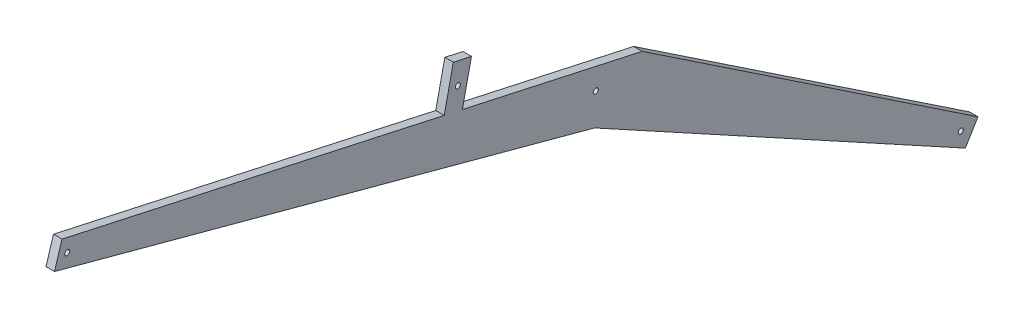
ISO-10303-21;
HEADER;
FILE_DESCRIPTION(('STEP AP214'),'2;1');
FILE_NAME('part.step','',(''),(''),'','','');
FILE_SCHEMA(('AUTOMOTIVE_DESIGN { 1 0 10303 214 1 1 1 1 }'));
ENDSEC;
DATA;
#1=APPLICATION_CONTEXT('core data for automotive mechanical design processes');
#2=APPLICATION_PROTOCOL_DEFINITION('international standard','automotive_design',2000,#1);
#3=PRODUCT_CONTEXT('',#1,'mechanical');
#4=PRODUCT('Part','Part','',(#3));
#5=PRODUCT_RELATED_PRODUCT_CATEGORY('part','',(#4));
#6=PRODUCT_DEFINITION_FORMATION('','',#4);
#7=PRODUCT_DEFINITION_CONTEXT('part definition',#1,'design');
#8=PRODUCT_DEFINITION('design','',#6,#7);
#9=PRODUCT_DEFINITION_SHAPE('','',#8);
#10=(LENGTH_UNIT() NAMED_UNIT(*) SI_UNIT(.MILLI.,.METRE.));
#11=(NAMED_UNIT(*) PLANE_ANGLE_UNIT() SI_UNIT($,.RADIAN.));
#12=(NAMED_UNIT(*) SI_UNIT($,.STERADIAN.) SOLID_ANGLE_UNIT());
#13=UNCERTAINTY_MEASURE_WITH_UNIT(LENGTH_MEASURE(1.E-05),#10,'distance_accuracy_value','');
#14=(GEOMETRIC_REPRESENTATION_CONTEXT(3) GLOBAL_UNCERTAINTY_ASSIGNED_CONTEXT((#13)) GLOBAL_UNIT_ASSIGNED_CONTEXT((#10,
#11,#12)) REPRESENTATION_CONTEXT('',''));
#15=CARTESIAN_POINT('',(0.,0.,0.));
#16=DIRECTION('',(0.,0.,1.));
#17=DIRECTION('',(1.,0.,0.));
#18=AXIS2_PLACEMENT_3D('',#15,#16,#17);
#19=CARTESIAN_POINT('',(2.,4.79250623305249,-1.05296749149856));
#20=DIRECTION('',(0.,0.976703612269334,-0.214592762645982));
#21=DIRECTION('',(0.,0.214592762645982,0.976703612269334));
#22=AXIS2_PLACEMENT_3D('',#19,#20,#21);
#23=PLANE('',#22);
#24=DIRECTION('',(0.,-0.214592762645982,-0.976703612269334));
#25=VECTOR('',#24,1.);
#26=CARTESIAN_POINT('',(0.,4.79250623305249,-1.05296749149856));
#27=LINE('',#26,#25);
#28=CARTESIAN_POINT('',(0.,11.9245197347709,31.4078819052435));
#29=VERTEX_POINT('',#28);
#30=CARTESIAN_POINT('',(0.,2.62561576152217,-10.9154145043419));
#31=VERTEX_POINT('',#30);
#32=EDGE_CURVE('E57',#29,#31,#27,.T.);
#33=ORIENTED_EDGE('',*,*,#32,.F.);
#34=DIRECTION('',(1.,0.,0.));
#35=VECTOR('',#34,1.);
#36=CARTESIAN_POINT('',(0.,11.9245197347709,31.4078819052435));
#37=LINE('',#36,#35);
#38=CARTESIAN_POINT('',(2.,11.9245197347709,31.4078819052435));
#39=VERTEX_POINT('',#38);
#40=EDGE_CURVE('E52',#29,#39,#37,.T.);
#41=ORIENTED_EDGE('',*,*,#40,.T.);
#42=DIRECTION('',(0.,-0.214592762645982,-0.976703612269334));
#43=VECTOR('',#42,1.);
#44=CARTESIAN_POINT('',(2.,4.79250623305249,-1.05296749149856));
#45=LINE('',#44,#43);
#46=CARTESIAN_POINT('',(2.,2.62561576152217,-10.9154145043419));
#47=VERTEX_POINT('',#46);
#48=EDGE_CURVE('E148',#39,#47,#45,.T.);
#49=ORIENTED_EDGE('',*,*,#48,.T.);
#50=DIRECTION('',(-1.,0.,0.));
#51=VECTOR('',#50,1.);
#52=CARTESIAN_POINT('',(2.,2.62561576152217,-10.9154145043419));
#53=LINE('',#52,#51);
#54=EDGE_CURVE('E171',#47,#31,#53,.T.);
#55=ORIENTED_EDGE('',*,*,#54,.T.);
#56=EDGE_LOOP('',(#33,#41,#49,#55));
#57=FACE_BOUND('',#56,.T.);
#58=ADVANCED_FACE('F37',(#57),#23,.T.);
#59=DIRECTION('',(1.,0.,0.));
#60=VECTOR('',#59,1.);
#61=CARTESIAN_POINT('',(0.,12.8626527381667,35.6777271782518));
#62=LINE('',#61,#60);
#63=CARTESIAN_POINT('',(0.,12.8626527381667,35.6777271782518));
#64=VERTEX_POINT('',#63);
#65=CARTESIAN_POINT('',(2.,12.8626527381667,35.6777271782518));
#66=VERTEX_POINT('',#65);
#67=EDGE_CURVE('E221',#64,#66,#62,.T.);
#68=ORIENTED_EDGE('',*,*,#67,.F.);
#69=CARTESIAN_POINT('',(0.,32.6339353986017,125.665306235157));
#70=VERTEX_POINT('',#69);
#71=EDGE_CURVE('E138',#70,#64,#27,.T.);
#72=ORIENTED_EDGE('',*,*,#71,.F.);
#73=DIRECTION('',(-1.,0.,0.));
#74=VECTOR('',#73,1.);
#75=CARTESIAN_POINT('',(2.,32.6339353986017,125.665306235157));
#76=LINE('',#75,#74);
#77=CARTESIAN_POINT('',(2.,32.6339353986017,125.665306235157));
#78=VERTEX_POINT('',#77);
#79=EDGE_CURVE('E11',#78,#70,#76,.T.);
#80=ORIENTED_EDGE('',*,*,#79,.F.);
#81=EDGE_CURVE('E145',#78,#66,#45,.T.);
#82=ORIENTED_EDGE('',*,*,#81,.T.);
#83=EDGE_LOOP('',(#68,#72,#80,#82));
#84=FACE_BOUND('',#83,.T.);
#85=ADVANCED_FACE('F39',(#84),#23,.T.);
#86=CARTESIAN_POINT('',(2.,38.0916917003325,123.988577829521));
#87=DIRECTION('',(0.,0.293672829043445,0.955905994060933));
#88=DIRECTION('',(0.,-0.955905994060933,0.293672829043445));
#89=AXIS2_PLACEMENT_3D('',#86,#87,#88);
#90=PLANE('',#89);
#91=DIRECTION('',(0.,0.955905994060933,-0.293672829043445));
#92=VECTOR('',#91,1.);
#93=CARTESIAN_POINT('',(0.,38.0916917003325,123.988577829521));
#94=LINE('',#93,#92);
#95=CARTESIAN_POINT('',(0.,26.8984994342361,127.427343209417));
#96=VERTEX_POINT('',#95);
#97=EDGE_CURVE('E173',#96,#70,#94,.T.);
#98=ORIENTED_EDGE('',*,*,#97,.F.);
#99=DIRECTION('',(-1.,0.,0.));
#100=VECTOR('',#99,1.);
#101=CARTESIAN_POINT('',(2.,26.8984994342361,127.427343209417));
#102=LINE('',#101,#100);
#103=CARTESIAN_POINT('',(2.,26.8984994342361,127.427343209417));
#104=VERTEX_POINT('',#103);
#105=EDGE_CURVE('E45',#104,#96,#102,.T.);
#106=ORIENTED_EDGE('',*,*,#105,.F.);
#107=DIRECTION('',(0.,0.955905994060933,-0.293672829043445));
#108=VECTOR('',#107,1.);
#109=CARTESIAN_POINT('',(2.,38.0916917003325,123.988577829521));
#110=LINE('',#109,#108);
#111=EDGE_CURVE('E147',#104,#78,#110,.T.);
#112=ORIENTED_EDGE('',*,*,#111,.T.);
#113=ORIENTED_EDGE('',*,*,#79,.T.);
#114=EDGE_LOOP('',(#98,#106,#112,#113));
#115=FACE_BOUND('',#114,.T.);
#116=ADVANCED_FACE('F209',(#115),#90,.T.);
#117=CARTESIAN_POINT('',(2.,-6.96456575263825,1.87848416848594));
#118=DIRECTION('',(0.,-0.965497029657275,0.260414065908467));
#119=DIRECTION('',(0.,-0.260414065908467,-0.965497029657275));
#120=AXIS2_PLACEMENT_3D('',#117,#118,#119);
#121=PLANE('',#120);
#122=DIRECTION('',(0.,0.260414065908467,0.965497029657275));
#123=VECTOR('',#122,1.);
#124=CARTESIAN_POINT('',(0.,-6.96456575263825,1.87848416848594));
#125=LINE('',#124,#123);
#126=CARTESIAN_POINT('',(0.,-7.39402857334479,0.286231168273015));
#127=VERTEX_POINT('',#126);
#128=EDGE_CURVE('E175',#127,#96,#125,.T.);
#129=ORIENTED_EDGE('',*,*,#128,.F.);
#130=DIRECTION('',(-1.,0.,0.));
#131=VECTOR('',#130,1.);
#132=CARTESIAN_POINT('',(2.,-7.39402857334479,0.286231168273015));
#133=LINE('',#132,#131);
#134=CARTESIAN_POINT('',(2.,-7.39402857334479,0.286231168273015));
#135=VERTEX_POINT('',#134);
#136=EDGE_CURVE('E201',#135,#127,#133,.T.);
#137=ORIENTED_EDGE('',*,*,#136,.F.);
#138=DIRECTION('',(0.,0.260414065908467,0.965497029657275));
#139=VECTOR('',#138,1.);
#140=CARTESIAN_POINT('',(2.,-6.96456575263825,1.87848416848594));
#141=LINE('',#140,#139);
#142=EDGE_CURVE('E151',#135,#104,#141,.T.);
#143=ORIENTED_EDGE('',*,*,#142,.T.);
#144=ORIENTED_EDGE('',*,*,#105,.T.);
#145=EDGE_LOOP('',(#129,#137,#143,#144));
#146=FACE_BOUND('',#145,.T.);
#147=ADVANCED_FACE('F205',(#146),#121,.T.);
#148=CARTESIAN_POINT('',(2.,-5.81097899190438,3.1794867622562));
#149=DIRECTION('',(0.,-0.877268949695257,0.479999156145696));
#150=DIRECTION('',(0.,-0.479999156145696,-0.877268949695257));
#151=AXIS2_PLACEMENT_3D('',#148,#149,#150);
#152=PLANE('',#151);
#153=DIRECTION('',(0.,0.479999156145696,0.877268949695257));
#154=VECTOR('',#153,1.);
#155=CARTESIAN_POINT('',(0.,-5.81097899190438,3.1794867622562));
#156=LINE('',#155,#154);
#157=CARTESIAN_POINT('',(0.,-55.1568229279631,-87.007289875477));
#158=VERTEX_POINT('',#157);
#159=EDGE_CURVE('E178',#158,#127,#156,.T.);
#160=ORIENTED_EDGE('',*,*,#159,.F.);
#161=DIRECTION('',(-1.,0.,0.));
#162=VECTOR('',#161,1.);
#163=CARTESIAN_POINT('',(2.,-55.1568229279631,-87.007289875477));
#164=LINE('',#163,#162);
#165=CARTESIAN_POINT('',(2.,-55.1568229279631,-87.007289875477));
#166=VERTEX_POINT('',#165);
#167=EDGE_CURVE('E199',#166,#158,#164,.T.);
#168=ORIENTED_EDGE('',*,*,#167,.F.);
#169=DIRECTION('',(0.,0.479999156145696,0.877268949695257));
#170=VECTOR('',#169,1.);
#171=CARTESIAN_POINT('',(2.,-5.81097899190438,3.1794867622562));
#172=LINE('',#171,#170);
#173=EDGE_CURVE('E154',#166,#135,#172,.T.);
#174=ORIENTED_EDGE('',*,*,#173,.T.);
#175=ORIENTED_EDGE('',*,*,#136,.T.);
#176=EDGE_LOOP('',(#160,#168,#174,#175));
#177=FACE_BOUND('',#176,.T.);
#178=ADVANCED_FACE('F213',(#177),#152,.T.);
#179=CARTESIAN_POINT('',(2.,-53.3989528646726,-88.0730912380987));
#180=DIRECTION('',(0.,-0.51845311081064,-0.85510605885514));
#181=DIRECTION('',(0.,0.85510605885514,-0.51845311081064));
#182=AXIS2_PLACEMENT_3D('',#179,#180,#181);
#183=PLANE('',#182);
#184=DIRECTION('',(0.,-0.85510605885514,0.51845311081064));
#185=VECTOR('',#184,1.);
#186=CARTESIAN_POINT('',(0.,-53.3989528646726,-88.0730912380987));
#187=LINE('',#186,#185);
#188=CARTESIAN_POINT('',(0.,-50.2490124511014,-89.9829086103094));
#189=VERTEX_POINT('',#188);
#190=EDGE_CURVE('E181',#189,#158,#187,.T.);
#191=ORIENTED_EDGE('',*,*,#190,.F.);
#192=DIRECTION('',(-1.,0.,0.));
#193=VECTOR('',#192,1.);
#194=CARTESIAN_POINT('',(2.,-50.2490124511014,-89.9829086103094));
#195=LINE('',#194,#193);
#196=CARTESIAN_POINT('',(2.,-50.2490124511014,-89.9829086103094));
#197=VERTEX_POINT('',#196);
#198=EDGE_CURVE('E197',#197,#189,#195,.T.);
#199=ORIENTED_EDGE('',*,*,#198,.F.);
#200=DIRECTION('',(0.,-0.85510605885514,0.51845311081064));
#201=VECTOR('',#200,1.);
#202=CARTESIAN_POINT('',(2.,-53.3989528646726,-88.0730912380987));
#203=LINE('',#202,#201);
#204=EDGE_CURVE('E157',#197,#166,#203,.T.);
#205=ORIENTED_EDGE('',*,*,#204,.T.);
#206=ORIENTED_EDGE('',*,*,#167,.T.);
#207=EDGE_LOOP('',(#191,#199,#205,#206));
#208=FACE_BOUND('',#207,.T.);
#209=ADVANCED_FACE('F271',(#208),#183,.T.);
#210=CARTESIAN_POINT('',(2.,29.2680264958656,124.428345500269));
#211=DIRECTION('',(-1.,0.,0.));
#212=DIRECTION('',(0.,0.,1.));
#213=AXIS2_PLACEMENT_3D('',#210,#211,#212);
#214=CYLINDRICAL_SURFACE('',#213,0.600000000000007);
#215=CARTESIAN_POINT('',(2.,29.2680264958656,124.428345500269));
#216=DIRECTION('',(1.,0.,0.));
#217=DIRECTION('',(0.,0.,-1.));
#218=AXIS2_PLACEMENT_3D('',#215,#216,#217);
#219=CIRCLE('',#218,0.600000000000007);
#220=CARTESIAN_POINT('',(2.,29.2680264958656,123.828345500269));
#221=VERTEX_POINT('',#220);
#222=EDGE_CURVE('E166',#221,#221,#219,.T.);
#223=ORIENTED_EDGE('',*,*,#222,.T.);
#224=EDGE_LOOP('',(#223));
#225=FACE_BOUND('',#224,.T.);
#226=CARTESIAN_POINT('',(0.,29.2680264958656,124.428345500269));
#227=DIRECTION('',(1.,0.,0.));
#228=DIRECTION('',(0.,0.,-1.));
#229=AXIS2_PLACEMENT_3D('',#226,#227,#228);
#230=CIRCLE('',#229,0.600000000000007);
#231=CARTESIAN_POINT('',(0.,29.2680264958656,123.828345500269));
#232=VERTEX_POINT('',#231);
#233=EDGE_CURVE('E190',#232,#232,#230,.T.);
#234=ORIENTED_EDGE('',*,*,#233,.F.);
#235=EDGE_LOOP('',(#234));
#236=FACE_BOUND('',#235,.T.);
#237=ADVANCED_FACE('F274',(#225,#236),#214,.F.);
#238=CARTESIAN_POINT('',(2.,-51.1475583571003,-85.9297810663278));
#239=DIRECTION('',(-1.,0.,0.));
#240=DIRECTION('',(0.,0.,1.));
#241=AXIS2_PLACEMENT_3D('',#238,#239,#240);
#242=CYLINDRICAL_SURFACE('',#241,0.599999999998035);
#243=CARTESIAN_POINT('',(2.,-51.1475583571003,-85.9297810663278));
#244=DIRECTION('',(1.,0.,0.));
#245=DIRECTION('',(0.,0.,-1.));
#246=AXIS2_PLACEMENT_3D('',#243,#244,#245);
#247=CIRCLE('',#246,0.599999999998035);
#248=CARTESIAN_POINT('',(2.,-51.1475583571003,-86.5297810663258));
#249=VERTEX_POINT('',#248);
#250=EDGE_CURVE('E163',#249,#249,#247,.T.);
#251=ORIENTED_EDGE('',*,*,#250,.T.);
#252=EDGE_LOOP('',(#251));
#253=FACE_BOUND('',#252,.T.);
#254=CARTESIAN_POINT('',(0.,-51.1475583571003,-85.9297810663278));
#255=DIRECTION('',(1.,0.,0.));
#256=DIRECTION('',(0.,0.,-1.));
#257=AXIS2_PLACEMENT_3D('',#254,#255,#256);
#258=CIRCLE('',#257,0.599999999998035);
#259=CARTESIAN_POINT('',(0.,-51.1475583571003,-86.5297810663258));
#260=VERTEX_POINT('',#259);
#261=EDGE_CURVE('E187',#260,#260,#258,.T.);
#262=ORIENTED_EDGE('',*,*,#261,.F.);
#263=EDGE_LOOP('',(#262));
#264=FACE_BOUND('',#263,.T.);
#265=ADVANCED_FACE('F278',(#253,#264),#242,.F.);
#266=CARTESIAN_POINT('',(2.,6.85812484916893,-4.58621846734603));
#267=DIRECTION('',(0.,0.831258694282055,-0.555885764506065));
#268=DIRECTION('',(0.,0.555885764506065,0.831258694282055));
#269=AXIS2_PLACEMENT_3D('',#266,#267,#268);
#270=PLANE('',#269);
#271=DIRECTION('',(0.,-0.555885764506065,-0.831258694282055));
#272=VECTOR('',#271,1.);
#273=CARTESIAN_POINT('',(0.,6.85812484916893,-4.58621846734603));
#274=LINE('',#273,#272);
#275=EDGE_CURVE('E184',#31,#189,#274,.T.);
#276=ORIENTED_EDGE('',*,*,#275,.F.);
#277=ORIENTED_EDGE('',*,*,#54,.F.);
#278=DIRECTION('',(0.,-0.555885764506065,-0.831258694282055));
#279=VECTOR('',#278,1.);
#280=CARTESIAN_POINT('',(2.,6.85812484916893,-4.58621846734603));
#281=LINE('',#280,#279);
#282=EDGE_CURVE('E160',#47,#197,#281,.T.);
#283=ORIENTED_EDGE('',*,*,#282,.T.);
#284=ORIENTED_EDGE('',*,*,#198,.T.);
#285=EDGE_LOOP('',(#276,#277,#283,#284));
#286=FACE_BOUND('',#285,.T.);
#287=ADVANCED_FACE('F252',(#286),#270,.T.);
#288=CARTESIAN_POINT('',(2.,0.,0.));
#289=DIRECTION('',(-1.,0.,0.));
#290=DIRECTION('',(0.,0.,1.));
#291=AXIS2_PLACEMENT_3D('',#288,#289,#290);
#292=CYLINDRICAL_SURFACE('',#291,0.600000000000006);
#293=CARTESIAN_POINT('',(2.,0.,0.));
#294=DIRECTION('',(1.,0.,0.));
#295=DIRECTION('',(0.,0.,-1.));
#296=AXIS2_PLACEMENT_3D('',#293,#294,#295);
#297=CIRCLE('',#296,0.600000000000006);
#298=CARTESIAN_POINT('',(2.,0.,-0.600000000000006));
#299=VERTEX_POINT('',#298);
#300=EDGE_CURVE('E169',#299,#299,#297,.T.);
#301=ORIENTED_EDGE('',*,*,#300,.T.);
#302=EDGE_LOOP('',(#301));
#303=FACE_BOUND('',#302,.T.);
#304=CARTESIAN_POINT('',(0.,0.,0.));
#305=DIRECTION('',(1.,0.,0.));
#306=DIRECTION('',(0.,0.,-1.));
#307=AXIS2_PLACEMENT_3D('',#304,#305,#306);
#308=CIRCLE('',#307,0.600000000000006);
#309=CARTESIAN_POINT('',(0.,0.,-0.600000000000006));
#310=VERTEX_POINT('',#309);
#311=EDGE_CURVE('E193',#310,#310,#308,.T.);
#312=ORIENTED_EDGE('',*,*,#311,.F.);
#313=EDGE_LOOP('',(#312));
#314=FACE_BOUND('',#313,.T.);
#315=ADVANCED_FACE('F243',(#303,#314),#292,.F.);
#316=CARTESIAN_POINT('',(2.,0.,0.));
#317=DIRECTION('',(1.,0.,0.));
#318=DIRECTION('',(0.,0.,-1.));
#319=AXIS2_PLACEMENT_3D('',#316,#317,#318);
#320=PLANE('',#319);
#321=CARTESIAN_POINT('',(2.,17.2771042978155,32.4698407285177));
#322=DIRECTION('',(1.,0.,0.));
#323=DIRECTION('',(0.,0.,-1.));
#324=AXIS2_PLACEMENT_3D('',#321,#322,#323);
#325=CIRCLE('',#324,0.6);
#326=CARTESIAN_POINT('',(2.,17.2771042978155,31.8698407285177));
#327=VERTEX_POINT('',#326);
#328=EDGE_CURVE('E226',#327,#327,#325,.T.);
#329=ORIENTED_EDGE('',*,*,#328,.F.);
#330=EDGE_LOOP('',(#329));
#331=FACE_BOUND('',#330,.T.);
#332=ORIENTED_EDGE('',*,*,#81,.F.);
#333=ORIENTED_EDGE('',*,*,#111,.F.);
#334=ORIENTED_EDGE('',*,*,#142,.F.);
#335=ORIENTED_EDGE('',*,*,#173,.F.);
#336=ORIENTED_EDGE('',*,*,#204,.F.);
#337=ORIENTED_EDGE('',*,*,#282,.F.);
#338=ORIENTED_EDGE('',*,*,#48,.F.);
#339=DIRECTION('',(0.,-0.976703612269334,0.214592762645982));
#340=VECTOR('',#339,1.);
#341=CARTESIAN_POINT('',(2.,21.6915558574643,29.2619542787837));
#342=LINE('',#341,#340);
#343=CARTESIAN_POINT('',(2.,21.6915558574643,29.2619542787837));
#344=VERTEX_POINT('',#343);
#345=EDGE_CURVE('E141',#344,#39,#342,.T.);
#346=ORIENTED_EDGE('',*,*,#345,.F.);
#347=DIRECTION('',(0.,0.214592762645982,0.976703612269334));
#348=VECTOR('',#347,1.);
#349=CARTESIAN_POINT('',(2.,21.6915558574643,29.2619542787837));
#350=LINE('',#349,#348);
#351=CARTESIAN_POINT('',(2.,22.62968886086,33.531799551792));
#352=VERTEX_POINT('',#351);
#353=EDGE_CURVE('E123',#344,#352,#350,.T.);
#354=ORIENTED_EDGE('',*,*,#353,.T.);
#355=DIRECTION('',(0.,-0.976703612269334,0.214592762645982));
#356=VECTOR('',#355,1.);
#357=CARTESIAN_POINT('',(2.,22.62968886086,33.531799551792));
#358=LINE('',#357,#356);
#359=EDGE_CURVE('E119',#352,#66,#358,.T.);
#360=ORIENTED_EDGE('',*,*,#359,.T.);
#361=EDGE_LOOP('',(#332,#333,#334,#335,#336,#337,#338,#346,#354,#360));
#362=FACE_BOUND('',#361,.T.);
#363=ORIENTED_EDGE('',*,*,#250,.F.);
#364=EDGE_LOOP('',(#363));
#365=FACE_BOUND('',#364,.T.);
#366=ORIENTED_EDGE('',*,*,#222,.F.);
#367=EDGE_LOOP('',(#366));
#368=FACE_BOUND('',#367,.T.);
#369=ORIENTED_EDGE('',*,*,#300,.F.);
#370=EDGE_LOOP('',(#369));
#371=FACE_BOUND('',#370,.T.);
#372=ADVANCED_FACE('F217',(#331,#362,#365,#368,#371),#320,.T.);
#373=CARTESIAN_POINT('',(0.,0.,0.));
#374=DIRECTION('',(1.,0.,0.));
#375=DIRECTION('',(0.,0.,-1.));
#376=AXIS2_PLACEMENT_3D('',#373,#374,#375);
#377=PLANE('',#376);
#378=CARTESIAN_POINT('',(0.,17.2771042978155,32.4698407285177));
#379=DIRECTION('',(1.,0.,0.));
#380=DIRECTION('',(0.,0.,-1.));
#381=AXIS2_PLACEMENT_3D('',#378,#379,#380);
#382=CIRCLE('',#381,0.6);
#383=CARTESIAN_POINT('',(0.,17.2771042978155,31.8698407285177));
#384=VERTEX_POINT('',#383);
#385=EDGE_CURVE('E222',#384,#384,#382,.T.);
#386=ORIENTED_EDGE('',*,*,#385,.T.);
#387=EDGE_LOOP('',(#386));
#388=FACE_BOUND('',#387,.T.);
#389=ORIENTED_EDGE('',*,*,#71,.T.);
#390=DIRECTION('',(0.,-0.976703612269334,0.214592762645982));
#391=VECTOR('',#390,1.);
#392=CARTESIAN_POINT('',(0.,22.62968886086,33.531799551792));
#393=LINE('',#392,#391);
#394=CARTESIAN_POINT('',(0.,22.62968886086,33.531799551792));
#395=VERTEX_POINT('',#394);
#396=EDGE_CURVE('E117',#395,#64,#393,.T.);
#397=ORIENTED_EDGE('',*,*,#396,.F.);
#398=DIRECTION('',(0.,0.214592762645982,0.976703612269334));
#399=VECTOR('',#398,1.);
#400=CARTESIAN_POINT('',(0.,21.6915558574643,29.2619542787837));
#401=LINE('',#400,#399);
#402=CARTESIAN_POINT('',(0.,21.6915558574643,29.2619542787837));
#403=VERTEX_POINT('',#402);
#404=EDGE_CURVE('E124',#403,#395,#401,.T.);
#405=ORIENTED_EDGE('',*,*,#404,.F.);
#406=DIRECTION('',(0.,-0.976703612269334,0.214592762645982));
#407=VECTOR('',#406,1.);
#408=CARTESIAN_POINT('',(0.,21.6915558574643,29.2619542787837));
#409=LINE('',#408,#407);
#410=EDGE_CURVE('E231',#403,#29,#409,.T.);
#411=ORIENTED_EDGE('',*,*,#410,.T.);
#412=ORIENTED_EDGE('',*,*,#32,.T.);
#413=ORIENTED_EDGE('',*,*,#275,.T.);
#414=ORIENTED_EDGE('',*,*,#190,.T.);
#415=ORIENTED_EDGE('',*,*,#159,.T.);
#416=ORIENTED_EDGE('',*,*,#128,.T.);
#417=ORIENTED_EDGE('',*,*,#97,.T.);
#418=EDGE_LOOP('',(#389,#397,#405,#411,#412,#413,#414,#415,#416,#417));
#419=FACE_BOUND('',#418,.T.);
#420=ORIENTED_EDGE('',*,*,#261,.T.);
#421=EDGE_LOOP('',(#420));
#422=FACE_BOUND('',#421,.T.);
#423=ORIENTED_EDGE('',*,*,#233,.T.);
#424=EDGE_LOOP('',(#423));
#425=FACE_BOUND('',#424,.T.);
#426=ORIENTED_EDGE('',*,*,#311,.T.);
#427=EDGE_LOOP('',(#426));
#428=FACE_BOUND('',#427,.T.);
#429=ADVANCED_FACE('F134',(#388,#419,#422,#425,#428),#377,.F.);
#430=CARTESIAN_POINT('',(0.,22.62968886086,33.531799551792));
#431=DIRECTION('',(0.,-0.214592762645982,-0.976703612269334));
#432=DIRECTION('',(0.,0.976703612269334,-0.214592762645982));
#433=AXIS2_PLACEMENT_3D('',#430,#431,#432);
#434=PLANE('',#433);
#435=ORIENTED_EDGE('',*,*,#67,.T.);
#436=ORIENTED_EDGE('',*,*,#359,.F.);
#437=DIRECTION('',(1.,0.,0.));
#438=VECTOR('',#437,1.);
#439=CARTESIAN_POINT('',(0.,22.62968886086,33.531799551792));
#440=LINE('',#439,#438);
#441=EDGE_CURVE('E112',#395,#352,#440,.T.);
#442=ORIENTED_EDGE('',*,*,#441,.F.);
#443=ORIENTED_EDGE('',*,*,#396,.T.);
#444=EDGE_LOOP('',(#435,#436,#442,#443));
#445=FACE_BOUND('',#444,.T.);
#446=ADVANCED_FACE('F115',(#445),#434,.F.);
#447=CARTESIAN_POINT('',(0.,21.6915558574643,29.2619542787837));
#448=DIRECTION('',(0.,-0.214592762645982,-0.976703612269334));
#449=DIRECTION('',(0.,0.976703612269334,-0.214592762645982));
#450=AXIS2_PLACEMENT_3D('',#447,#448,#449);
#451=PLANE('',#450);
#452=ORIENTED_EDGE('',*,*,#40,.F.);
#453=ORIENTED_EDGE('',*,*,#410,.F.);
#454=DIRECTION('',(1.,0.,0.));
#455=VECTOR('',#454,1.);
#456=CARTESIAN_POINT('',(0.,21.6915558574643,29.2619542787837));
#457=LINE('',#456,#455);
#458=EDGE_CURVE('E130',#403,#344,#457,.T.);
#459=ORIENTED_EDGE('',*,*,#458,.T.);
#460=ORIENTED_EDGE('',*,*,#345,.T.);
#461=EDGE_LOOP('',(#452,#453,#459,#460));
#462=FACE_BOUND('',#461,.T.);
#463=ADVANCED_FACE('F234',(#462),#451,.T.);
#464=CARTESIAN_POINT('',(0.,14.5595423557458,-3.19889511795839));
#465=DIRECTION('',(0.,0.976703612269334,-0.214592762645982));
#466=DIRECTION('',(0.,0.214592762645982,0.976703612269334));
#467=AXIS2_PLACEMENT_3D('',#464,#465,#466);
#468=PLANE('',#467);
#469=ORIENTED_EDGE('',*,*,#404,.T.);
#470=ORIENTED_EDGE('',*,*,#441,.T.);
#471=ORIENTED_EDGE('',*,*,#353,.F.);
#472=ORIENTED_EDGE('',*,*,#458,.F.);
#473=EDGE_LOOP('',(#469,#470,#471,#472));
#474=FACE_BOUND('',#473,.T.);
#475=ADVANCED_FACE('F128',(#474),#468,.T.);
#476=CARTESIAN_POINT('',(0.,17.2771042978155,32.4698407285177));
#477=DIRECTION('',(1.,0.,0.));
#478=DIRECTION('',(0.,0.,-1.));
#479=AXIS2_PLACEMENT_3D('',#476,#477,#478);
#480=CYLINDRICAL_SURFACE('',#479,0.6);
#481=ORIENTED_EDGE('',*,*,#385,.F.);
#482=EDGE_LOOP('',(#481));
#483=FACE_BOUND('',#482,.T.);
#484=ORIENTED_EDGE('',*,*,#328,.T.);
#485=EDGE_LOOP('',(#484));
#486=FACE_BOUND('',#485,.T.);
#487=ADVANCED_FACE('F240',(#483,#486),#480,.F.);
#488=CLOSED_SHELL('',(#58,#85,#116,#147,#178,#209,#237,#265,#287,#315,#372,#429,#446,#463,#475,#487));
#489=MANIFOLD_SOLID_BREP('B2',#488);
#490=ADVANCED_BREP_SHAPE_REPRESENTATION('',(#18,#489),#14);
#491=SHAPE_DEFINITION_REPRESENTATION(#9,#490);
ENDSEC;
END-ISO-10303-21;
